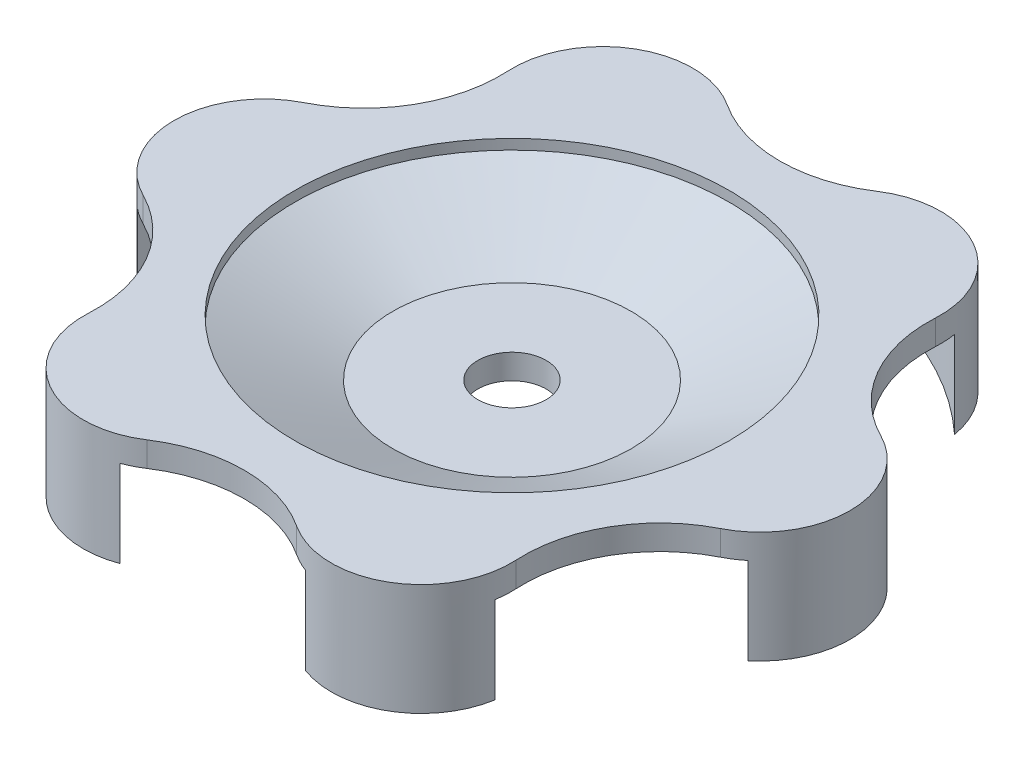
ISO-10303-21;
HEADER;
FILE_DESCRIPTION(('STEP AP214'),'2;1');
FILE_NAME('part.step','',(''),(''),'','','');
FILE_SCHEMA(('AUTOMOTIVE_DESIGN { 1 0 10303 214 1 1 1 1 }'));
ENDSEC;
DATA;
#1=APPLICATION_CONTEXT('core data for automotive mechanical design processes');
#2=APPLICATION_PROTOCOL_DEFINITION('international standard','automotive_design',2000,#1);
#3=PRODUCT_CONTEXT('',#1,'mechanical');
#4=PRODUCT('Part','Part','',(#3));
#5=PRODUCT_RELATED_PRODUCT_CATEGORY('part','',(#4));
#6=PRODUCT_DEFINITION_FORMATION('','',#4);
#7=PRODUCT_DEFINITION_CONTEXT('part definition',#1,'design');
#8=PRODUCT_DEFINITION('design','',#6,#7);
#9=PRODUCT_DEFINITION_SHAPE('','',#8);
#10=(LENGTH_UNIT() NAMED_UNIT(*) SI_UNIT(.MILLI.,.METRE.));
#11=(NAMED_UNIT(*) PLANE_ANGLE_UNIT() SI_UNIT($,.RADIAN.));
#12=(NAMED_UNIT(*) SI_UNIT($,.STERADIAN.) SOLID_ANGLE_UNIT());
#13=UNCERTAINTY_MEASURE_WITH_UNIT(LENGTH_MEASURE(1.E-05),#10,'distance_accuracy_value','');
#14=(GEOMETRIC_REPRESENTATION_CONTEXT(3) GLOBAL_UNCERTAINTY_ASSIGNED_CONTEXT((#13)) GLOBAL_UNIT_ASSIGNED_CONTEXT((#10,
#11,#12)) REPRESENTATION_CONTEXT('',''));
#15=CARTESIAN_POINT('',(0.,0.,0.));
#16=DIRECTION('',(0.,0.,1.));
#17=DIRECTION('',(1.,0.,0.));
#18=AXIS2_PLACEMENT_3D('',#15,#16,#17);
#19=CARTESIAN_POINT('',(0.,0.,0.));
#20=DIRECTION('',(0.,-1.,0.));
#21=DIRECTION('',(1.,0.,0.));
#22=AXIS2_PLACEMENT_3D('',#19,#20,#21);
#23=CYLINDRICAL_SURFACE('',#22,25.25);
#24=DIRECTION('',(0.,-1.,0.));
#25=VECTOR('',#24,1.);
#26=CARTESIAN_POINT('',(-17.1476738593355,5.5,18.5342866389259));
#27=LINE('',#26,#25);
#28=CARTESIAN_POINT('',(-17.1476738593355,6.99999999999987,18.5342866389259));
#29=VERTEX_POINT('',#28);
#30=CARTESIAN_POINT('',(-17.1476738593355,0.,18.5342866389259));
#31=VERTEX_POINT('',#30);
#32=EDGE_CURVE('E485',#29,#31,#27,.T.);
#33=ORIENTED_EDGE('',*,*,#32,.F.);
#34=CARTESIAN_POINT('',(0.,6.99999999999991,0.));
#35=DIRECTION('',(0.,-1.,0.));
#36=DIRECTION('',(1.,0.,0.));
#37=AXIS2_PLACEMENT_3D('',#34,#35,#36);
#38=CIRCLE('',#37,25.25);
#39=CARTESIAN_POINT('',(-7.47732614066478,6.9999999999999,24.1174644974577));
#40=VERTEX_POINT('',#39);
#41=EDGE_CURVE('E527',#40,#29,#38,.T.);
#42=ORIENTED_EDGE('',*,*,#41,.F.);
#43=DIRECTION('',(0.,-1.,0.));
#44=VECTOR('',#43,1.);
#45=CARTESIAN_POINT('',(-7.47732614066478,5.5,24.1174644974577));
#46=LINE('',#45,#44);
#47=CARTESIAN_POINT('',(-7.47732614066478,0.,24.1174644974577));
#48=VERTEX_POINT('',#47);
#49=EDGE_CURVE('E482',#48,#40,#46,.F.);
#50=ORIENTED_EDGE('',*,*,#49,.F.);
#51=CARTESIAN_POINT('',(0.,0.,0.));
#52=DIRECTION('',(0.,-1.,0.));
#53=DIRECTION('',(1.,0.,0.));
#54=AXIS2_PLACEMENT_3D('',#51,#52,#53);
#55=CIRCLE('',#54,25.25);
#56=EDGE_CURVE('E276',#48,#31,#55,.T.);
#57=ORIENTED_EDGE('',*,*,#56,.T.);
#58=EDGE_LOOP('',(#33,#42,#50,#57));
#59=FACE_BOUND('',#58,.T.);
#60=ADVANCED_FACE('F88',(#59),#23,.F.);
#61=DIRECTION('',(0.,-1.,0.));
#62=VECTOR('',#61,1.);
#63=CARTESIAN_POINT('',(7.4773261406646,5.5,24.1174644974578));
#64=LINE('',#63,#62);
#65=CARTESIAN_POINT('',(7.4773261406646,6.99999999999995,24.1174644974578));
#66=VERTEX_POINT('',#65);
#67=CARTESIAN_POINT('',(7.47732614066462,0.,24.1174644974578));
#68=VERTEX_POINT('',#67);
#69=EDGE_CURVE('E473',#66,#68,#64,.T.);
#70=ORIENTED_EDGE('',*,*,#69,.F.);
#71=CARTESIAN_POINT('',(17.1476738593353,6.99999999999998,18.5342866389259));
#72=VERTEX_POINT('',#71);
#73=EDGE_CURVE('E260',#72,#66,#38,.T.);
#74=ORIENTED_EDGE('',*,*,#73,.F.);
#75=DIRECTION('',(0.,-1.,0.));
#76=VECTOR('',#75,1.);
#77=CARTESIAN_POINT('',(17.1476738593353,5.5,18.5342866389259));
#78=LINE('',#77,#76);
#79=CARTESIAN_POINT('',(17.1476738593353,0.,18.534286638926));
#80=VERTEX_POINT('',#79);
#81=EDGE_CURVE('E469',#80,#72,#78,.F.);
#82=ORIENTED_EDGE('',*,*,#81,.F.);
#83=EDGE_CURVE('E282',#80,#68,#55,.T.);
#84=ORIENTED_EDGE('',*,*,#83,.T.);
#85=EDGE_LOOP('',(#70,#74,#82,#84));
#86=FACE_BOUND('',#85,.T.);
#87=ADVANCED_FACE('F572',(#86),#23,.F.);
#88=DIRECTION('',(0.,-1.,0.));
#89=VECTOR('',#88,1.);
#90=CARTESIAN_POINT('',(24.625,5.5,5.58317785853183));
#91=LINE('',#90,#89);
#92=CARTESIAN_POINT('',(24.625,7.00000000000001,5.58317785853185));
#93=VERTEX_POINT('',#92);
#94=CARTESIAN_POINT('',(24.625,0.,5.58317785853182));
#95=VERTEX_POINT('',#94);
#96=EDGE_CURVE('E458',#93,#95,#91,.T.);
#97=ORIENTED_EDGE('',*,*,#96,.F.);
#98=CARTESIAN_POINT('',(24.625,7.00000000000001,-5.58317785853171));
#99=VERTEX_POINT('',#98);
#100=EDGE_CURVE('E324',#99,#93,#38,.T.);
#101=ORIENTED_EDGE('',*,*,#100,.F.);
#102=DIRECTION('',(0.,-1.,0.));
#103=VECTOR('',#102,1.);
#104=CARTESIAN_POINT('',(24.625,5.5,-5.58317785853169));
#105=LINE('',#104,#103);
#106=CARTESIAN_POINT('',(24.6250000000001,0.,-5.58317785853168));
#107=VERTEX_POINT('',#106);
#108=EDGE_CURVE('E462',#107,#99,#105,.F.);
#109=ORIENTED_EDGE('',*,*,#108,.F.);
#110=EDGE_CURVE('E285',#107,#95,#55,.T.);
#111=ORIENTED_EDGE('',*,*,#110,.T.);
#112=EDGE_LOOP('',(#97,#101,#109,#111));
#113=FACE_BOUND('',#112,.T.);
#114=ADVANCED_FACE('F576',(#113),#23,.F.);
#115=DIRECTION('',(0.,-1.,0.));
#116=VECTOR('',#115,1.);
#117=CARTESIAN_POINT('',(17.1476738593356,5.5,-18.5342866389257));
#118=LINE('',#117,#116);
#119=CARTESIAN_POINT('',(17.1476738593356,6.99999999999998,-18.5342866389257));
#120=VERTEX_POINT('',#119);
#121=CARTESIAN_POINT('',(17.1476738593356,0.,-18.5342866389257));
#122=VERTEX_POINT('',#121);
#123=EDGE_CURVE('E445',#120,#122,#118,.T.);
#124=ORIENTED_EDGE('',*,*,#123,.F.);
#125=CARTESIAN_POINT('',(7.47732614066493,6.99999999999995,-24.1174644974577));
#126=VERTEX_POINT('',#125);
#127=EDGE_CURVE('E327',#126,#120,#38,.T.);
#128=ORIENTED_EDGE('',*,*,#127,.F.);
#129=DIRECTION('',(0.,-1.,0.));
#130=VECTOR('',#129,1.);
#131=CARTESIAN_POINT('',(7.47732614066493,5.5,-24.1174644974577));
#132=LINE('',#131,#130);
#133=CARTESIAN_POINT('',(7.47732614066493,0.,-24.1174644974577));
#134=VERTEX_POINT('',#133);
#135=EDGE_CURVE('E449',#134,#126,#132,.F.);
#136=ORIENTED_EDGE('',*,*,#135,.F.);
#137=EDGE_CURVE('E284',#134,#122,#55,.T.);
#138=ORIENTED_EDGE('',*,*,#137,.T.);
#139=EDGE_LOOP('',(#124,#128,#136,#138));
#140=FACE_BOUND('',#139,.T.);
#141=ADVANCED_FACE('F549',(#140),#23,.F.);
#142=DIRECTION('',(0.,-1.,0.));
#143=VECTOR('',#142,1.);
#144=CARTESIAN_POINT('',(-7.47732614066448,5.5,-24.1174644974578));
#145=LINE('',#144,#143);
#146=CARTESIAN_POINT('',(-7.47732614066448,6.9999999999999,-24.1174644974578));
#147=VERTEX_POINT('',#146);
#148=CARTESIAN_POINT('',(-7.47732614066446,0.,-24.1174644974578));
#149=VERTEX_POINT('',#148);
#150=EDGE_CURVE('E435',#147,#149,#145,.T.);
#151=ORIENTED_EDGE('',*,*,#150,.F.);
#152=CARTESIAN_POINT('',(-17.1476738593352,6.99999999999987,-18.5342866389261));
#153=VERTEX_POINT('',#152);
#154=EDGE_CURVE('E535',#153,#147,#38,.T.);
#155=ORIENTED_EDGE('',*,*,#154,.F.);
#156=DIRECTION('',(0.,-1.,0.));
#157=VECTOR('',#156,1.);
#158=CARTESIAN_POINT('',(-17.1476738593352,5.5,-18.5342866389261));
#159=LINE('',#158,#157);
#160=CARTESIAN_POINT('',(-17.1476738593352,0.,-18.5342866389261));
#161=VERTEX_POINT('',#160);
#162=EDGE_CURVE('E431',#161,#153,#159,.F.);
#163=ORIENTED_EDGE('',*,*,#162,.F.);
#164=EDGE_CURVE('E277',#161,#149,#55,.T.);
#165=ORIENTED_EDGE('',*,*,#164,.T.);
#166=EDGE_LOOP('',(#151,#155,#163,#165));
#167=FACE_BOUND('',#166,.T.);
#168=ADVANCED_FACE('F580',(#167),#23,.F.);
#169=CARTESIAN_POINT('',(27.25,7.00000000000002,0.));
#170=DIRECTION('',(0.,-1.,0.));
#171=DIRECTION('',(1.,0.,0.));
#172=AXIS2_PLACEMENT_3D('',#169,#170,#171);
#173=PLANE('',#172);
#174=CARTESIAN_POINT('',(0.,6.99999999999993,0.));
#175=DIRECTION('',(0.,-1.,0.));
#176=DIRECTION('',(1.,0.,0.));
#177=AXIS2_PLACEMENT_3D('',#174,#175,#176);
#178=CIRCLE('',#177,19.5);
#179=CARTESIAN_POINT('',(19.5,7.,0.));
#180=VERTEX_POINT('',#179);
#181=EDGE_CURVE('E320',#180,#180,#178,.T.);
#182=ORIENTED_EDGE('',*,*,#181,.F.);
#183=EDGE_LOOP('',(#182));
#184=FACE_BOUND('',#183,.T.);
#185=CARTESIAN_POINT('',(-10.0000000000001,6.99999999999989,17.3205080756887));
#186=DIRECTION('',(0.,-1.,0.));
#187=DIRECTION('',(1.,0.,0.));
#188=AXIS2_PLACEMENT_3D('',#185,#186,#187);
#189=CIRCLE('',#188,7.25000000000001);
#190=CARTESIAN_POINT('',(-6.02739726027408,6.99999999999996,23.385236220653));
#191=VERTEX_POINT('',#190);
#192=EDGE_CURVE('E479',#40,#191,#189,.F.);
#193=ORIENTED_EDGE('',*,*,#192,.F.);
#194=ORIENTED_EDGE('',*,*,#41,.T.);
#195=CARTESIAN_POINT('',(-17.2385100104486,6.99999999999991,16.9124972564244));
#196=VERTEX_POINT('',#195);
#197=EDGE_CURVE('E112',#196,#29,#189,.F.);
#198=ORIENTED_EDGE('',*,*,#197,.F.);
#199=CARTESIAN_POINT('',(-28.2210769228533,6.99999999999983,16.2934463582302));
#200=DIRECTION('',(0.,-1.,0.));
#201=DIRECTION('',(1.,0.,0.));
#202=AXIS2_PLACEMENT_3D('',#199,#200,#201);
#203=CIRCLE('',#202,11.);
#204=CARTESIAN_POINT('',(-23.2659072707225,6.99999999999988,6.47273896422836));
#205=VERTEX_POINT('',#204);
#206=EDGE_CURVE('E290',#196,#205,#203,.F.);
#207=ORIENTED_EDGE('',*,*,#206,.T.);
#208=CARTESIAN_POINT('',(-20.,6.99999999999985,-1.39659253553725E-13));
#209=DIRECTION('',(0.,-1.,0.));
#210=DIRECTION('',(1.,0.,0.));
#211=AXIS2_PLACEMENT_3D('',#208,#209,#210);
#212=CIRCLE('',#211,7.25000000000001);
#213=CARTESIAN_POINT('',(-24.6250000000001,6.99999999999984,5.58317785853161));
#214=VERTEX_POINT('',#213);
#215=EDGE_CURVE('E419',#214,#205,#212,.F.);
#216=ORIENTED_EDGE('',*,*,#215,.F.);
#217=CARTESIAN_POINT('',(-24.625,6.99999999999984,-5.58317785853195));
#218=VERTEX_POINT('',#217);
#219=EDGE_CURVE('E531',#214,#218,#38,.T.);
#220=ORIENTED_EDGE('',*,*,#219,.T.);
#221=CARTESIAN_POINT('',(-23.2659072707224,6.99999999999988,-6.47273896422873));
#222=VERTEX_POINT('',#221);
#223=EDGE_CURVE('E267',#222,#218,#212,.F.);
#224=ORIENTED_EDGE('',*,*,#223,.F.);
#225=CARTESIAN_POINT('',(-28.221076922853,6.99999999999983,-16.2934463582307));
#226=DIRECTION('',(0.,-1.,0.));
#227=DIRECTION('',(1.,0.,0.));
#228=AXIS2_PLACEMENT_3D('',#225,#226,#227);
#229=CIRCLE('',#228,11.);
#230=CARTESIAN_POINT('',(-17.2385100104484,6.99999999999986,-16.9124972564247));
#231=VERTEX_POINT('',#230);
#232=EDGE_CURVE('E488',#222,#231,#229,.F.);
#233=ORIENTED_EDGE('',*,*,#232,.T.);
#234=CARTESIAN_POINT('',(-9.99999999999984,6.99999999999989,-17.3205080756889));
#235=DIRECTION('',(0.,-1.,0.));
#236=DIRECTION('',(1.,0.,0.));
#237=AXIS2_PLACEMENT_3D('',#234,#235,#236);
#238=CIRCLE('',#237,7.25000000000001);
#239=EDGE_CURVE('E428',#153,#231,#238,.F.);
#240=ORIENTED_EDGE('',*,*,#239,.F.);
#241=ORIENTED_EDGE('',*,*,#154,.T.);
#242=CARTESIAN_POINT('',(-6.02739726027371,6.99999999999991,-23.3852362206531));
#243=VERTEX_POINT('',#242);
#244=EDGE_CURVE('E432',#243,#147,#238,.F.);
#245=ORIENTED_EDGE('',*,*,#244,.F.);
#246=CARTESIAN_POINT('',(3.92047505570758E-13,6.99999999999992,-32.5868927164608));
#247=DIRECTION('',(0.,-1.,0.));
#248=DIRECTION('',(1.,0.,0.));
#249=AXIS2_PLACEMENT_3D('',#246,#247,#248);
#250=CIRCLE('',#249,11.);
#251=CARTESIAN_POINT('',(6.02739726027424,6.99999999999996,-23.385236220653));
#252=VERTEX_POINT('',#251);
#253=EDGE_CURVE('E492',#243,#252,#250,.F.);
#254=ORIENTED_EDGE('',*,*,#253,.T.);
#255=CARTESIAN_POINT('',(10.0000000000002,6.99999999999996,-17.3205080756887));
#256=DIRECTION('',(0.,-1.,0.));
#257=DIRECTION('',(1.,0.,0.));
#258=AXIS2_PLACEMENT_3D('',#255,#256,#257);
#259=CIRCLE('',#258,7.25000000000003);
#260=EDGE_CURVE('E446',#126,#252,#259,.F.);
#261=ORIENTED_EDGE('',*,*,#260,.F.);
#262=ORIENTED_EDGE('',*,*,#127,.T.);
#263=CARTESIAN_POINT('',(17.2385100104488,6.99999999999998,-16.9124972564243));
#264=VERTEX_POINT('',#263);
#265=EDGE_CURVE('E442',#264,#120,#259,.F.);
#266=ORIENTED_EDGE('',*,*,#265,.F.);
#267=CARTESIAN_POINT('',(28.2210769228534,7.00000000000002,-16.29344635823));
#268=DIRECTION('',(0.,-1.,0.));
#269=DIRECTION('',(1.,0.,0.));
#270=AXIS2_PLACEMENT_3D('',#267,#268,#269);
#271=CIRCLE('',#270,10.9999999999999);
#272=CARTESIAN_POINT('',(23.2659072707226,7.00000000000006,-6.47273896422836));
#273=VERTEX_POINT('',#272);
#274=EDGE_CURVE('E496',#264,#273,#271,.F.);
#275=ORIENTED_EDGE('',*,*,#274,.T.);
#276=CARTESIAN_POINT('',(20.,6.99999999999999,0.));
#277=DIRECTION('',(0.,-1.,0.));
#278=DIRECTION('',(1.,0.,0.));
#279=AXIS2_PLACEMENT_3D('',#276,#277,#278);
#280=CIRCLE('',#279,7.24999999999996);
#281=EDGE_CURVE('E459',#99,#273,#280,.F.);
#282=ORIENTED_EDGE('',*,*,#281,.F.);
#283=ORIENTED_EDGE('',*,*,#100,.T.);
#284=CARTESIAN_POINT('',(23.2659072707225,7.00000000000002,6.47273896422858));
#285=VERTEX_POINT('',#284);
#286=EDGE_CURVE('E455',#285,#93,#280,.F.);
#287=ORIENTED_EDGE('',*,*,#286,.F.);
#288=CARTESIAN_POINT('',(28.2210769228531,7.00000000000002,16.2934463582305));
#289=DIRECTION('',(0.,-1.,0.));
#290=DIRECTION('',(1.,0.,0.));
#291=AXIS2_PLACEMENT_3D('',#288,#289,#290);
#292=CIRCLE('',#291,11.);
#293=CARTESIAN_POINT('',(17.2385100104485,7.00000000000006,16.9124972564245));
#294=VERTEX_POINT('',#293);
#295=EDGE_CURVE('E500',#285,#294,#292,.F.);
#296=ORIENTED_EDGE('',*,*,#295,.T.);
#297=CARTESIAN_POINT('',(9.99999999999996,6.99999999999996,17.3205080756888));
#298=DIRECTION('',(0.,-1.,0.));
#299=DIRECTION('',(1.,0.,0.));
#300=AXIS2_PLACEMENT_3D('',#297,#298,#299);
#301=CIRCLE('',#300,7.25000000000002);
#302=EDGE_CURVE('E379',#72,#294,#301,.F.);
#303=ORIENTED_EDGE('',*,*,#302,.F.);
#304=ORIENTED_EDGE('',*,*,#73,.T.);
#305=CARTESIAN_POINT('',(6.02739726027388,6.99999999999998,23.385236220653));
#306=VERTEX_POINT('',#305);
#307=EDGE_CURVE('E470',#306,#66,#301,.F.);
#308=ORIENTED_EDGE('',*,*,#307,.F.);
#309=CARTESIAN_POINT('',(-1.66533453693773E-13,6.99999999999992,32.5868927164608));
#310=DIRECTION('',(0.,-1.,0.));
#311=DIRECTION('',(1.,0.,0.));
#312=AXIS2_PLACEMENT_3D('',#309,#310,#311);
#313=CIRCLE('',#312,11.);
#314=EDGE_CURVE('E502',#306,#191,#313,.F.);
#315=ORIENTED_EDGE('',*,*,#314,.T.);
#316=EDGE_LOOP('',(#193,#194,#198,#207,#216,#220,#224,#233,#240,#241,#245,#254,#261,#262,#266,
#275,#282,#283,#287,#296,#303,#304,#308,#315));
#317=FACE_BOUND('',#316,.T.);
#318=ADVANCED_FACE('F511',(#184,#317),#173,.T.);
#319=CARTESIAN_POINT('',(27.25,9.00000000000002,0.));
#320=DIRECTION('',(0.,-1.,0.));
#321=DIRECTION('',(1.,0.,0.));
#322=AXIS2_PLACEMENT_3D('',#319,#320,#321);
#323=PLANE('',#322);
#324=CARTESIAN_POINT('',(-1.66533453693773E-13,8.99999999999992,32.5868927164608));
#325=DIRECTION('',(0.,-1.,0.));
#326=DIRECTION('',(1.,0.,0.));
#327=AXIS2_PLACEMENT_3D('',#324,#325,#326);
#328=CIRCLE('',#327,11.);
#329=CARTESIAN_POINT('',(6.02739726027388,8.99999999999998,23.385236220653));
#330=VERTEX_POINT('',#329);
#331=CARTESIAN_POINT('',(-6.02739726027408,8.99999999999996,23.385236220653));
#332=VERTEX_POINT('',#331);
#333=EDGE_CURVE('E13',#330,#332,#328,.F.);
#334=ORIENTED_EDGE('',*,*,#333,.F.);
#335=CARTESIAN_POINT('',(9.99999999999996,8.99999999999996,17.3205080756888));
#336=DIRECTION('',(0.,-1.,0.));
#337=DIRECTION('',(1.,0.,0.));
#338=AXIS2_PLACEMENT_3D('',#335,#336,#337);
#339=CIRCLE('',#338,7.25000000000002);
#340=CARTESIAN_POINT('',(17.2385100104485,9.00000000000006,16.9124972564245));
#341=VERTEX_POINT('',#340);
#342=EDGE_CURVE('E376',#330,#341,#339,.F.);
#343=ORIENTED_EDGE('',*,*,#342,.T.);
#344=CARTESIAN_POINT('',(28.2210769228531,9.00000000000002,16.2934463582305));
#345=DIRECTION('',(0.,-1.,0.));
#346=DIRECTION('',(1.,0.,0.));
#347=AXIS2_PLACEMENT_3D('',#344,#345,#346);
#348=CIRCLE('',#347,11.);
#349=CARTESIAN_POINT('',(23.2659072707225,9.00000000000002,6.47273896422858));
#350=VERTEX_POINT('',#349);
#351=EDGE_CURVE('E97',#350,#341,#348,.F.);
#352=ORIENTED_EDGE('',*,*,#351,.F.);
#353=CARTESIAN_POINT('',(20.,8.99999999999999,0.));
#354=DIRECTION('',(0.,-1.,0.));
#355=DIRECTION('',(1.,0.,0.));
#356=AXIS2_PLACEMENT_3D('',#353,#354,#355);
#357=CIRCLE('',#356,7.24999999999996);
#358=CARTESIAN_POINT('',(23.2659072707226,9.00000000000006,-6.47273896422836));
#359=VERTEX_POINT('',#358);
#360=EDGE_CURVE('E452',#350,#359,#357,.F.);
#361=ORIENTED_EDGE('',*,*,#360,.T.);
#362=CARTESIAN_POINT('',(28.2210769228534,9.00000000000002,-16.29344635823));
#363=DIRECTION('',(0.,-1.,0.));
#364=DIRECTION('',(1.,0.,0.));
#365=AXIS2_PLACEMENT_3D('',#362,#363,#364);
#366=CIRCLE('',#365,10.9999999999999);
#367=CARTESIAN_POINT('',(17.2385100104488,8.99999999999998,-16.9124972564243));
#368=VERTEX_POINT('',#367);
#369=EDGE_CURVE('E358',#368,#359,#366,.F.);
#370=ORIENTED_EDGE('',*,*,#369,.F.);
#371=CARTESIAN_POINT('',(10.0000000000002,8.99999999999996,-17.3205080756887));
#372=DIRECTION('',(0.,-1.,0.));
#373=DIRECTION('',(1.,0.,0.));
#374=AXIS2_PLACEMENT_3D('',#371,#372,#373);
#375=CIRCLE('',#374,7.25000000000003);
#376=CARTESIAN_POINT('',(6.02739726027424,8.99999999999996,-23.385236220653));
#377=VERTEX_POINT('',#376);
#378=EDGE_CURVE('E438',#368,#377,#375,.F.);
#379=ORIENTED_EDGE('',*,*,#378,.T.);
#380=CARTESIAN_POINT('',(3.92047505570758E-13,8.99999999999992,-32.5868927164608));
#381=DIRECTION('',(0.,-1.,0.));
#382=DIRECTION('',(1.,0.,0.));
#383=AXIS2_PLACEMENT_3D('',#380,#381,#382);
#384=CIRCLE('',#383,11.);
#385=CARTESIAN_POINT('',(-6.02739726027371,8.99999999999991,-23.3852362206531));
#386=VERTEX_POINT('',#385);
#387=EDGE_CURVE('E355',#386,#377,#384,.F.);
#388=ORIENTED_EDGE('',*,*,#387,.F.);
#389=CARTESIAN_POINT('',(-9.99999999999984,8.99999999999989,-17.3205080756889));
#390=DIRECTION('',(0.,-1.,0.));
#391=DIRECTION('',(1.,0.,0.));
#392=AXIS2_PLACEMENT_3D('',#389,#390,#391);
#393=CIRCLE('',#392,7.25000000000001);
#394=CARTESIAN_POINT('',(-17.2385100104484,8.99999999999986,-16.9124972564247));
#395=VERTEX_POINT('',#394);
#396=EDGE_CURVE('E272',#386,#395,#393,.F.);
#397=ORIENTED_EDGE('',*,*,#396,.T.);
#398=CARTESIAN_POINT('',(-28.221076922853,8.99999999999983,-16.2934463582307));
#399=DIRECTION('',(0.,-1.,0.));
#400=DIRECTION('',(1.,0.,0.));
#401=AXIS2_PLACEMENT_3D('',#398,#399,#400);
#402=CIRCLE('',#401,11.);
#403=CARTESIAN_POINT('',(-23.2659072707224,8.99999999999988,-6.47273896422873));
#404=VERTEX_POINT('',#403);
#405=EDGE_CURVE('E348',#404,#395,#402,.F.);
#406=ORIENTED_EDGE('',*,*,#405,.F.);
#407=CARTESIAN_POINT('',(-20.,8.99999999999986,-1.39659253553725E-13));
#408=DIRECTION('',(0.,-1.,0.));
#409=DIRECTION('',(1.,0.,0.));
#410=AXIS2_PLACEMENT_3D('',#407,#408,#409);
#411=CIRCLE('',#410,7.25000000000001);
#412=CARTESIAN_POINT('',(-23.2659072707225,8.99999999999985,6.47273896422836));
#413=VERTEX_POINT('',#412);
#414=EDGE_CURVE('E104',#404,#413,#411,.F.);
#415=ORIENTED_EDGE('',*,*,#414,.T.);
#416=CARTESIAN_POINT('',(-28.2210769228533,8.99999999999983,16.2934463582302));
#417=DIRECTION('',(0.,-1.,0.));
#418=DIRECTION('',(1.,0.,0.));
#419=AXIS2_PLACEMENT_3D('',#416,#417,#418);
#420=CIRCLE('',#419,11.);
#421=CARTESIAN_POINT('',(-17.2385100104486,8.99999999999991,16.9124972564244));
#422=VERTEX_POINT('',#421);
#423=EDGE_CURVE('E351',#422,#413,#420,.F.);
#424=ORIENTED_EDGE('',*,*,#423,.F.);
#425=CARTESIAN_POINT('',(-10.0000000000001,8.99999999999989,17.3205080756887));
#426=DIRECTION('',(0.,-1.,0.));
#427=DIRECTION('',(1.,0.,0.));
#428=AXIS2_PLACEMENT_3D('',#425,#426,#427);
#429=CIRCLE('',#428,7.25000000000001);
#430=EDGE_CURVE('E476',#422,#332,#429,.F.);
#431=ORIENTED_EDGE('',*,*,#430,.T.);
#432=EDGE_LOOP('',(#334,#343,#352,#361,#370,#379,#388,#397,#406,#415,#424,#431));
#433=FACE_BOUND('',#432,.T.);
#434=CARTESIAN_POINT('',(0.,8.99999999999994,0.));
#435=DIRECTION('',(0.,-1.,0.));
#436=DIRECTION('',(1.,0.,0.));
#437=AXIS2_PLACEMENT_3D('',#434,#435,#436);
#438=CIRCLE('',#437,17.5);
#439=CARTESIAN_POINT('',(17.5,9.,0.));
#440=VERTEX_POINT('',#439);
#441=EDGE_CURVE('E292',#440,#440,#438,.T.);
#442=ORIENTED_EDGE('',*,*,#441,.T.);
#443=EDGE_LOOP('',(#442));
#444=FACE_BOUND('',#443,.T.);
#445=ADVANCED_FACE('F594',(#433,#444),#323,.F.);
#446=CARTESIAN_POINT('',(27.25,0.,0.));
#447=DIRECTION('',(0.,1.,0.));
#448=DIRECTION('',(-1.,0.,0.));
#449=AXIS2_PLACEMENT_3D('',#446,#447,#448);
#450=PLANE('',#449);
#451=ORIENTED_EDGE('',*,*,#56,.F.);
#452=CARTESIAN_POINT('',(-10.0000000000001,-1.28369537222284E-13,17.3205080756887));
#453=DIRECTION('',(0.,1.,0.));
#454=DIRECTION('',(-1.,0.,0.));
#455=AXIS2_PLACEMENT_3D('',#452,#453,#454);
#456=CIRCLE('',#455,7.25000000000001);
#457=EDGE_CURVE('E344',#48,#31,#456,.F.);
#458=ORIENTED_EDGE('',*,*,#457,.T.);
#459=EDGE_LOOP('',(#451,#458));
#460=FACE_BOUND('',#459,.T.);
#461=ADVANCED_FACE('F568',(#460),#450,.F.);
#462=ORIENTED_EDGE('',*,*,#83,.F.);
#463=CARTESIAN_POINT('',(9.99999999999996,0.,17.3205080756888));
#464=DIRECTION('',(0.,1.,0.));
#465=DIRECTION('',(-1.,0.,0.));
#466=AXIS2_PLACEMENT_3D('',#463,#464,#465);
#467=CIRCLE('',#466,7.25000000000002);
#468=EDGE_CURVE('E340',#80,#68,#467,.F.);
#469=ORIENTED_EDGE('',*,*,#468,.T.);
#470=EDGE_LOOP('',(#462,#469));
#471=FACE_BOUND('',#470,.T.);
#472=ADVANCED_FACE('F566',(#471),#450,.F.);
#473=ORIENTED_EDGE('',*,*,#110,.F.);
#474=CARTESIAN_POINT('',(20.,0.,0.));
#475=DIRECTION('',(0.,1.,0.));
#476=DIRECTION('',(-1.,0.,0.));
#477=AXIS2_PLACEMENT_3D('',#474,#475,#476);
#478=CIRCLE('',#477,7.24999999999996);
#479=EDGE_CURVE('E336',#107,#95,#478,.F.);
#480=ORIENTED_EDGE('',*,*,#479,.T.);
#481=EDGE_LOOP('',(#473,#480));
#482=FACE_BOUND('',#481,.T.);
#483=ADVANCED_FACE('F559',(#482),#450,.F.);
#484=ORIENTED_EDGE('',*,*,#137,.F.);
#485=CARTESIAN_POINT('',(10.0000000000002,0.,-17.3205080756887));
#486=DIRECTION('',(0.,1.,0.));
#487=DIRECTION('',(-1.,0.,0.));
#488=AXIS2_PLACEMENT_3D('',#485,#486,#487);
#489=CIRCLE('',#488,7.25000000000003);
#490=EDGE_CURVE('E332',#134,#122,#489,.F.);
#491=ORIENTED_EDGE('',*,*,#490,.T.);
#492=EDGE_LOOP('',(#484,#491));
#493=FACE_BOUND('',#492,.T.);
#494=ADVANCED_FACE('F555',(#493),#450,.F.);
#495=ORIENTED_EDGE('',*,*,#164,.F.);
#496=CARTESIAN_POINT('',(-9.99999999999984,-1.28369537222284E-13,-17.3205080756889));
#497=DIRECTION('',(0.,1.,0.));
#498=DIRECTION('',(-1.,0.,0.));
#499=AXIS2_PLACEMENT_3D('',#496,#497,#498);
#500=CIRCLE('',#499,7.25000000000001);
#501=EDGE_CURVE('E259',#161,#149,#500,.F.);
#502=ORIENTED_EDGE('',*,*,#501,.T.);
#503=EDGE_LOOP('',(#495,#502));
#504=FACE_BOUND('',#503,.T.);
#505=ADVANCED_FACE('F558',(#504),#450,.F.);
#506=CARTESIAN_POINT('',(-20.,-1.61329283265843E-13,-1.39659253553725E-13));
#507=DIRECTION('',(0.,1.,0.));
#508=DIRECTION('',(-1.,0.,0.));
#509=AXIS2_PLACEMENT_3D('',#506,#507,#508);
#510=CIRCLE('',#509,7.25000000000001);
#511=CARTESIAN_POINT('',(-24.6250000000001,0.,5.58317785853164));
#512=VERTEX_POINT('',#511);
#513=CARTESIAN_POINT('',(-24.625,0.,-5.58317785853198));
#514=VERTEX_POINT('',#513);
#515=EDGE_CURVE('E251',#512,#514,#510,.F.);
#516=ORIENTED_EDGE('',*,*,#515,.T.);
#517=EDGE_CURVE('E255',#512,#514,#55,.T.);
#518=ORIENTED_EDGE('',*,*,#517,.F.);
#519=EDGE_LOOP('',(#516,#518));
#520=FACE_BOUND('',#519,.T.);
#521=ADVANCED_FACE('F253',(#520),#450,.F.);
#522=DIRECTION('',(0.,-1.,0.));
#523=VECTOR('',#522,1.);
#524=CARTESIAN_POINT('',(-24.625,5.5,-5.58317785853196));
#525=LINE('',#524,#523);
#526=EDGE_CURVE('E263',#218,#514,#525,.T.);
#527=ORIENTED_EDGE('',*,*,#526,.F.);
#528=ORIENTED_EDGE('',*,*,#219,.F.);
#529=DIRECTION('',(0.,-1.,0.));
#530=VECTOR('',#529,1.);
#531=CARTESIAN_POINT('',(-24.6250000000001,5.5,5.58317785853161));
#532=LINE('',#531,#530);
#533=EDGE_CURVE('E274',#512,#214,#532,.F.);
#534=ORIENTED_EDGE('',*,*,#533,.F.);
#535=ORIENTED_EDGE('',*,*,#517,.T.);
#536=EDGE_LOOP('',(#527,#528,#534,#535));
#537=FACE_BOUND('',#536,.T.);
#538=ADVANCED_FACE('F90',(#537),#23,.F.);
#539=CARTESIAN_POINT('',(0.,0.,0.));
#540=DIRECTION('',(0.,-1.,0.));
#541=DIRECTION('',(1.,0.,0.));
#542=AXIS2_PLACEMENT_3D('',#539,#540,#541);
#543=CYLINDRICAL_SURFACE('',#542,19.5);
#544=ORIENTED_EDGE('',*,*,#181,.T.);
#545=EDGE_LOOP('',(#544));
#546=FACE_BOUND('',#545,.T.);
#547=CARTESIAN_POINT('',(0.,6.90585947838493,0.));
#548=DIRECTION('',(0.,-1.,0.));
#549=DIRECTION('',(1.,0.,0.));
#550=AXIS2_PLACEMENT_3D('',#547,#548,#549);
#551=CIRCLE('',#550,19.5);
#552=CARTESIAN_POINT('',(19.5,6.905859478385,0.));
#553=VERTEX_POINT('',#552);
#554=EDGE_CURVE('E316',#553,#553,#551,.T.);
#555=ORIENTED_EDGE('',*,*,#554,.F.);
#556=EDGE_LOOP('',(#555));
#557=FACE_BOUND('',#556,.T.);
#558=ADVANCED_FACE('F579',(#546,#557),#543,.T.);
#559=CARTESIAN_POINT('',(0.,2.49999999999996,0.));
#560=DIRECTION('',(0.,1.,0.));
#561=DIRECTION('',(-1.,0.,0.));
#562=AXIS2_PLACEMENT_3D('',#559,#560,#561);
#563=CONICAL_SURFACE('',#562,10.0516038578106,1.13446401379632);
#564=ORIENTED_EDGE('',*,*,#554,.T.);
#565=EDGE_LOOP('',(#564));
#566=FACE_BOUND('',#565,.T.);
#567=CARTESIAN_POINT('',(0.,2.49999999999996,0.));
#568=DIRECTION('',(0.,-1.,0.));
#569=DIRECTION('',(1.,0.,0.));
#570=AXIS2_PLACEMENT_3D('',#567,#568,#569);
#571=CIRCLE('',#570,10.0516038578106);
#572=CARTESIAN_POINT('',(10.0516038578106,2.49999999999999,0.));
#573=VERTEX_POINT('',#572);
#574=EDGE_CURVE('E312',#573,#573,#571,.T.);
#575=ORIENTED_EDGE('',*,*,#574,.F.);
#576=EDGE_LOOP('',(#575));
#577=FACE_BOUND('',#576,.T.);
#578=ADVANCED_FACE('F585',(#566,#577),#563,.T.);
#579=CARTESIAN_POINT('',(2.75,2.49999999999998,0.));
#580=DIRECTION('',(0.,-1.,0.));
#581=DIRECTION('',(1.,0.,0.));
#582=AXIS2_PLACEMENT_3D('',#579,#580,#581);
#583=PLANE('',#582);
#584=ORIENTED_EDGE('',*,*,#574,.T.);
#585=EDGE_LOOP('',(#584));
#586=FACE_BOUND('',#585,.T.);
#587=CARTESIAN_POINT('',(0.,2.49999999999999,0.));
#588=DIRECTION('',(0.,-1.,0.));
#589=DIRECTION('',(1.,0.,0.));
#590=AXIS2_PLACEMENT_3D('',#587,#588,#589);
#591=CIRCLE('',#590,2.75000000000001);
#592=CARTESIAN_POINT('',(2.75,2.5,0.));
#593=VERTEX_POINT('',#592);
#594=EDGE_CURVE('E308',#593,#593,#591,.T.);
#595=ORIENTED_EDGE('',*,*,#594,.F.);
#596=EDGE_LOOP('',(#595));
#597=FACE_BOUND('',#596,.T.);
#598=ADVANCED_FACE('F667',(#586,#597),#583,.T.);
#599=CARTESIAN_POINT('',(0.,0.,0.));
#600=DIRECTION('',(0.,-1.,0.));
#601=DIRECTION('',(1.,0.,0.));
#602=AXIS2_PLACEMENT_3D('',#599,#600,#601);
#603=CYLINDRICAL_SURFACE('',#602,2.75000000000001);
#604=CARTESIAN_POINT('',(0.,4.49999999999999,0.));
#605=DIRECTION('',(0.,-1.,0.));
#606=DIRECTION('',(1.,0.,0.));
#607=AXIS2_PLACEMENT_3D('',#604,#605,#606);
#608=CIRCLE('',#607,2.75000000000002);
#609=CARTESIAN_POINT('',(2.75,4.5,0.));
#610=VERTEX_POINT('',#609);
#611=EDGE_CURVE('E304',#610,#610,#608,.T.);
#612=ORIENTED_EDGE('',*,*,#611,.F.);
#613=EDGE_LOOP('',(#612));
#614=FACE_BOUND('',#613,.T.);
#615=ORIENTED_EDGE('',*,*,#594,.T.);
#616=EDGE_LOOP('',(#615));
#617=FACE_BOUND('',#616,.T.);
#618=ADVANCED_FACE('F663',(#614,#617),#603,.F.);
#619=CARTESIAN_POINT('',(2.75,4.49999999999998,0.));
#620=DIRECTION('',(0.,-1.,0.));
#621=DIRECTION('',(1.,0.,0.));
#622=AXIS2_PLACEMENT_3D('',#619,#620,#621);
#623=PLANE('',#622);
#624=CARTESIAN_POINT('',(0.,4.49999999999996,0.));
#625=DIRECTION('',(0.,-1.,0.));
#626=DIRECTION('',(1.,0.,0.));
#627=AXIS2_PLACEMENT_3D('',#624,#625,#626);
#628=CIRCLE('',#627,9.60821453252471);
#629=CARTESIAN_POINT('',(9.6082145325247,4.5,0.));
#630=VERTEX_POINT('',#629);
#631=EDGE_CURVE('E300',#630,#630,#628,.T.);
#632=ORIENTED_EDGE('',*,*,#631,.F.);
#633=EDGE_LOOP('',(#632));
#634=FACE_BOUND('',#633,.T.);
#635=ORIENTED_EDGE('',*,*,#611,.T.);
#636=EDGE_LOOP('',(#635));
#637=FACE_BOUND('',#636,.T.);
#638=ADVANCED_FACE('F655',(#634,#637),#623,.F.);
#639=CARTESIAN_POINT('',(0.,4.49999999999996,0.));
#640=DIRECTION('',(0.,1.,0.));
#641=DIRECTION('',(-1.,0.,0.));
#642=AXIS2_PLACEMENT_3D('',#639,#640,#641);
#643=CONICAL_SURFACE('',#642,9.60821453252471,1.13446401379632);
#644=CARTESIAN_POINT('',(0.,8.17999999999993,0.));
#645=DIRECTION('',(0.,-1.,0.));
#646=DIRECTION('',(1.,0.,0.));
#647=AXIS2_PLACEMENT_3D('',#644,#645,#646);
#648=CIRCLE('',#647,17.5);
#649=CARTESIAN_POINT('',(17.5,8.17999999999999,0.));
#650=VERTEX_POINT('',#649);
#651=EDGE_CURVE('E296',#650,#650,#648,.T.);
#652=ORIENTED_EDGE('',*,*,#651,.F.);
#653=EDGE_LOOP('',(#652));
#654=FACE_BOUND('',#653,.T.);
#655=ORIENTED_EDGE('',*,*,#631,.T.);
#656=EDGE_LOOP('',(#655));
#657=FACE_BOUND('',#656,.T.);
#658=ADVANCED_FACE('F649',(#654,#657),#643,.F.);
#659=CARTESIAN_POINT('',(0.,0.,0.));
#660=DIRECTION('',(0.,-1.,0.));
#661=DIRECTION('',(1.,0.,0.));
#662=AXIS2_PLACEMENT_3D('',#659,#660,#661);
#663=CYLINDRICAL_SURFACE('',#662,17.5);
#664=ORIENTED_EDGE('',*,*,#441,.F.);
#665=EDGE_LOOP('',(#664));
#666=FACE_BOUND('',#665,.T.);
#667=ORIENTED_EDGE('',*,*,#651,.T.);
#668=EDGE_LOOP('',(#667));
#669=FACE_BOUND('',#668,.T.);
#670=ADVANCED_FACE('F643',(#666,#669),#663,.F.);
#671=CARTESIAN_POINT('',(-28.2210769228533,11.,16.2934463582302));
#672=DIRECTION('',(0.,-1.,0.));
#673=DIRECTION('',(0.,0.,-1.));
#674=AXIS2_PLACEMENT_3D('',#671,#672,#673);
#675=CYLINDRICAL_SURFACE('',#674,11.);
#676=DIRECTION('',(0.,-1.,0.));
#677=VECTOR('',#676,1.);
#678=CARTESIAN_POINT('',(-17.2385100104486,11.,16.9124972564244));
#679=LINE('',#678,#677);
#680=EDGE_CURVE('E420',#422,#196,#679,.T.);
#681=ORIENTED_EDGE('',*,*,#680,.F.);
#682=ORIENTED_EDGE('',*,*,#423,.T.);
#683=DIRECTION('',(0.,-1.,0.));
#684=VECTOR('',#683,1.);
#685=CARTESIAN_POINT('',(-23.2659072707225,11.,6.47273896422836));
#686=LINE('',#685,#684);
#687=EDGE_CURVE('E413',#413,#205,#686,.T.);
#688=ORIENTED_EDGE('',*,*,#687,.T.);
#689=ORIENTED_EDGE('',*,*,#206,.F.);
#690=EDGE_LOOP('',(#681,#682,#688,#689));
#691=FACE_BOUND('',#690,.T.);
#692=ADVANCED_FACE('F515',(#691),#675,.F.);
#693=CARTESIAN_POINT('',(-1.66533453693773E-13,11.,32.5868927164608));
#694=DIRECTION('',(0.,-1.,0.));
#695=DIRECTION('',(0.,0.,-1.));
#696=AXIS2_PLACEMENT_3D('',#693,#694,#695);
#697=CYLINDRICAL_SURFACE('',#696,11.);
#698=DIRECTION('',(0.,-1.,0.));
#699=VECTOR('',#698,1.);
#700=CARTESIAN_POINT('',(6.02739726027388,11.,23.385236220653));
#701=LINE('',#700,#699);
#702=EDGE_CURVE('E381',#330,#306,#701,.T.);
#703=ORIENTED_EDGE('',*,*,#702,.F.);
#704=ORIENTED_EDGE('',*,*,#333,.T.);
#705=DIRECTION('',(0.,-1.,0.));
#706=VECTOR('',#705,1.);
#707=CARTESIAN_POINT('',(-6.02739726027408,11.,23.385236220653));
#708=LINE('',#707,#706);
#709=EDGE_CURVE('E385',#332,#191,#708,.T.);
#710=ORIENTED_EDGE('',*,*,#709,.T.);
#711=ORIENTED_EDGE('',*,*,#314,.F.);
#712=EDGE_LOOP('',(#703,#704,#710,#711));
#713=FACE_BOUND('',#712,.T.);
#714=ADVANCED_FACE('F523',(#713),#697,.F.);
#715=CARTESIAN_POINT('',(28.2210769228531,11.,16.2934463582305));
#716=DIRECTION('',(0.,-1.,0.));
#717=DIRECTION('',(0.,0.,-1.));
#718=AXIS2_PLACEMENT_3D('',#715,#716,#717);
#719=CYLINDRICAL_SURFACE('',#718,11.);
#720=DIRECTION('',(0.,-1.,0.));
#721=VECTOR('',#720,1.);
#722=CARTESIAN_POINT('',(23.2659072707225,11.,6.47273896422858));
#723=LINE('',#722,#721);
#724=EDGE_CURVE('E371',#350,#285,#723,.T.);
#725=ORIENTED_EDGE('',*,*,#724,.F.);
#726=ORIENTED_EDGE('',*,*,#351,.T.);
#727=DIRECTION('',(0.,-1.,0.));
#728=VECTOR('',#727,1.);
#729=CARTESIAN_POINT('',(17.2385100104485,11.,16.9124972564245));
#730=LINE('',#729,#728);
#731=EDGE_CURVE('E368',#341,#294,#730,.T.);
#732=ORIENTED_EDGE('',*,*,#731,.T.);
#733=ORIENTED_EDGE('',*,*,#295,.F.);
#734=EDGE_LOOP('',(#725,#726,#732,#733));
#735=FACE_BOUND('',#734,.T.);
#736=ADVANCED_FACE('F367',(#735),#719,.F.);
#737=CARTESIAN_POINT('',(28.2210769228534,11.,-16.29344635823));
#738=DIRECTION('',(0.,-1.,0.));
#739=DIRECTION('',(0.,0.,-1.));
#740=AXIS2_PLACEMENT_3D('',#737,#738,#739);
#741=CYLINDRICAL_SURFACE('',#740,10.9999999999999);
#742=DIRECTION('',(0.,-1.,0.));
#743=VECTOR('',#742,1.);
#744=CARTESIAN_POINT('',(17.2385100104488,11.,-16.9124972564243));
#745=LINE('',#744,#743);
#746=EDGE_CURVE('E394',#368,#264,#745,.T.);
#747=ORIENTED_EDGE('',*,*,#746,.F.);
#748=ORIENTED_EDGE('',*,*,#369,.T.);
#749=DIRECTION('',(0.,-1.,0.));
#750=VECTOR('',#749,1.);
#751=CARTESIAN_POINT('',(23.2659072707226,11.,-6.47273896422836));
#752=LINE('',#751,#750);
#753=EDGE_CURVE('E387',#359,#273,#752,.T.);
#754=ORIENTED_EDGE('',*,*,#753,.T.);
#755=ORIENTED_EDGE('',*,*,#274,.F.);
#756=EDGE_LOOP('',(#747,#748,#754,#755));
#757=FACE_BOUND('',#756,.T.);
#758=ADVANCED_FACE('F623',(#757),#741,.F.);
#759=CARTESIAN_POINT('',(3.92047505570758E-13,11.,-32.5868927164608));
#760=DIRECTION('',(0.,-1.,0.));
#761=DIRECTION('',(0.,0.,-1.));
#762=AXIS2_PLACEMENT_3D('',#759,#760,#761);
#763=CYLINDRICAL_SURFACE('',#762,11.);
#764=DIRECTION('',(0.,-1.,0.));
#765=VECTOR('',#764,1.);
#766=CARTESIAN_POINT('',(-6.02739726027371,11.,-23.3852362206531));
#767=LINE('',#766,#765);
#768=EDGE_CURVE('E402',#386,#243,#767,.T.);
#769=ORIENTED_EDGE('',*,*,#768,.F.);
#770=ORIENTED_EDGE('',*,*,#387,.T.);
#771=DIRECTION('',(0.,-1.,0.));
#772=VECTOR('',#771,1.);
#773=CARTESIAN_POINT('',(6.02739726027424,11.,-23.385236220653));
#774=LINE('',#773,#772);
#775=EDGE_CURVE('E398',#377,#252,#774,.T.);
#776=ORIENTED_EDGE('',*,*,#775,.T.);
#777=ORIENTED_EDGE('',*,*,#253,.F.);
#778=EDGE_LOOP('',(#769,#770,#776,#777));
#779=FACE_BOUND('',#778,.T.);
#780=ADVANCED_FACE('F626',(#779),#763,.F.);
#781=CARTESIAN_POINT('',(-28.221076922853,11.,-16.2934463582307));
#782=DIRECTION('',(0.,-1.,0.));
#783=DIRECTION('',(0.,0.,-1.));
#784=AXIS2_PLACEMENT_3D('',#781,#782,#783);
#785=CYLINDRICAL_SURFACE('',#784,11.);
#786=DIRECTION('',(0.,-1.,0.));
#787=VECTOR('',#786,1.);
#788=CARTESIAN_POINT('',(-23.2659072707224,11.,-6.47273896422873));
#789=LINE('',#788,#787);
#790=EDGE_CURVE('E410',#404,#222,#789,.T.);
#791=ORIENTED_EDGE('',*,*,#790,.F.);
#792=ORIENTED_EDGE('',*,*,#405,.T.);
#793=DIRECTION('',(0.,-1.,0.));
#794=VECTOR('',#793,1.);
#795=CARTESIAN_POINT('',(-17.2385100104484,11.,-16.9124972564247));
#796=LINE('',#795,#794);
#797=EDGE_CURVE('E406',#395,#231,#796,.T.);
#798=ORIENTED_EDGE('',*,*,#797,.T.);
#799=ORIENTED_EDGE('',*,*,#232,.F.);
#800=EDGE_LOOP('',(#791,#792,#798,#799));
#801=FACE_BOUND('',#800,.T.);
#802=ADVANCED_FACE('F630',(#801),#785,.F.);
#803=CARTESIAN_POINT('',(-10.0000000000001,11.,17.3205080756887));
#804=DIRECTION('',(0.,-1.,0.));
#805=DIRECTION('',(0.,0.,-1.));
#806=AXIS2_PLACEMENT_3D('',#803,#804,#805);
#807=CYLINDRICAL_SURFACE('',#806,7.25000000000001);
#808=ORIENTED_EDGE('',*,*,#32,.T.);
#809=ORIENTED_EDGE('',*,*,#457,.F.);
#810=ORIENTED_EDGE('',*,*,#49,.T.);
#811=ORIENTED_EDGE('',*,*,#192,.T.);
#812=ORIENTED_EDGE('',*,*,#709,.F.);
#813=ORIENTED_EDGE('',*,*,#430,.F.);
#814=ORIENTED_EDGE('',*,*,#680,.T.);
#815=ORIENTED_EDGE('',*,*,#197,.T.);
#816=EDGE_LOOP('',(#808,#809,#810,#811,#812,#813,#814,#815));
#817=FACE_BOUND('',#816,.T.);
#818=ADVANCED_FACE('F516',(#817),#807,.T.);
#819=CARTESIAN_POINT('',(9.99999999999996,11.,17.3205080756888));
#820=DIRECTION('',(0.,-1.,0.));
#821=DIRECTION('',(0.,0.,-1.));
#822=AXIS2_PLACEMENT_3D('',#819,#820,#821);
#823=CYLINDRICAL_SURFACE('',#822,7.25000000000002);
#824=ORIENTED_EDGE('',*,*,#69,.T.);
#825=ORIENTED_EDGE('',*,*,#468,.F.);
#826=ORIENTED_EDGE('',*,*,#81,.T.);
#827=ORIENTED_EDGE('',*,*,#302,.T.);
#828=ORIENTED_EDGE('',*,*,#731,.F.);
#829=ORIENTED_EDGE('',*,*,#342,.F.);
#830=ORIENTED_EDGE('',*,*,#702,.T.);
#831=ORIENTED_EDGE('',*,*,#307,.T.);
#832=EDGE_LOOP('',(#824,#825,#826,#827,#828,#829,#830,#831));
#833=FACE_BOUND('',#832,.T.);
#834=ADVANCED_FACE('F374',(#833),#823,.T.);
#835=CARTESIAN_POINT('',(20.,11.,0.));
#836=DIRECTION('',(0.,-1.,0.));
#837=DIRECTION('',(0.,0.,-1.));
#838=AXIS2_PLACEMENT_3D('',#835,#836,#837);
#839=CYLINDRICAL_SURFACE('',#838,7.24999999999996);
#840=ORIENTED_EDGE('',*,*,#108,.T.);
#841=ORIENTED_EDGE('',*,*,#281,.T.);
#842=ORIENTED_EDGE('',*,*,#753,.F.);
#843=ORIENTED_EDGE('',*,*,#360,.F.);
#844=ORIENTED_EDGE('',*,*,#724,.T.);
#845=ORIENTED_EDGE('',*,*,#286,.T.);
#846=ORIENTED_EDGE('',*,*,#96,.T.);
#847=ORIENTED_EDGE('',*,*,#479,.F.);
#848=EDGE_LOOP('',(#840,#841,#842,#843,#844,#845,#846,#847));
#849=FACE_BOUND('',#848,.T.);
#850=ADVANCED_FACE('F615',(#849),#839,.T.);
#851=CARTESIAN_POINT('',(10.0000000000002,11.,-17.3205080756887));
#852=DIRECTION('',(0.,-1.,0.));
#853=DIRECTION('',(0.,0.,-1.));
#854=AXIS2_PLACEMENT_3D('',#851,#852,#853);
#855=CYLINDRICAL_SURFACE('',#854,7.25000000000003);
#856=ORIENTED_EDGE('',*,*,#135,.T.);
#857=ORIENTED_EDGE('',*,*,#260,.T.);
#858=ORIENTED_EDGE('',*,*,#775,.F.);
#859=ORIENTED_EDGE('',*,*,#378,.F.);
#860=ORIENTED_EDGE('',*,*,#746,.T.);
#861=ORIENTED_EDGE('',*,*,#265,.T.);
#862=ORIENTED_EDGE('',*,*,#123,.T.);
#863=ORIENTED_EDGE('',*,*,#490,.F.);
#864=EDGE_LOOP('',(#856,#857,#858,#859,#860,#861,#862,#863));
#865=FACE_BOUND('',#864,.T.);
#866=ADVANCED_FACE('F553',(#865),#855,.T.);
#867=CARTESIAN_POINT('',(-9.99999999999984,11.,-17.3205080756889));
#868=DIRECTION('',(0.,-1.,0.));
#869=DIRECTION('',(0.,0.,-1.));
#870=AXIS2_PLACEMENT_3D('',#867,#868,#869);
#871=CYLINDRICAL_SURFACE('',#870,7.25000000000001);
#872=ORIENTED_EDGE('',*,*,#162,.T.);
#873=ORIENTED_EDGE('',*,*,#239,.T.);
#874=ORIENTED_EDGE('',*,*,#797,.F.);
#875=ORIENTED_EDGE('',*,*,#396,.F.);
#876=ORIENTED_EDGE('',*,*,#768,.T.);
#877=ORIENTED_EDGE('',*,*,#244,.T.);
#878=ORIENTED_EDGE('',*,*,#150,.T.);
#879=ORIENTED_EDGE('',*,*,#501,.F.);
#880=EDGE_LOOP('',(#872,#873,#874,#875,#876,#877,#878,#879));
#881=FACE_BOUND('',#880,.T.);
#882=ADVANCED_FACE('F600',(#881),#871,.T.);
#883=CARTESIAN_POINT('',(-20.,11.,-1.39659253553725E-13));
#884=DIRECTION('',(0.,-1.,0.));
#885=DIRECTION('',(0.,0.,-1.));
#886=AXIS2_PLACEMENT_3D('',#883,#884,#885);
#887=CYLINDRICAL_SURFACE('',#886,7.25000000000001);
#888=ORIENTED_EDGE('',*,*,#526,.T.);
#889=ORIENTED_EDGE('',*,*,#515,.F.);
#890=ORIENTED_EDGE('',*,*,#533,.T.);
#891=ORIENTED_EDGE('',*,*,#215,.T.);
#892=ORIENTED_EDGE('',*,*,#687,.F.);
#893=ORIENTED_EDGE('',*,*,#414,.F.);
#894=ORIENTED_EDGE('',*,*,#790,.T.);
#895=ORIENTED_EDGE('',*,*,#223,.T.);
#896=EDGE_LOOP('',(#888,#889,#890,#891,#892,#893,#894,#895));
#897=FACE_BOUND('',#896,.T.);
#898=ADVANCED_FACE('F264',(#897),#887,.T.);
#899=CLOSED_SHELL('',(#60,#87,#114,#141,#168,#318,#445,#461,#472,#483,#494,#505,#521,#538,#558,
#578,#598,#618,#638,#658,#670,#692,#714,#736,#758,#780,#802,#818,#834,#850,#866,#882,#898));
#900=MANIFOLD_SOLID_BREP('B2',#899);
#901=ADVANCED_BREP_SHAPE_REPRESENTATION('',(#18,#900),#14);
#902=SHAPE_DEFINITION_REPRESENTATION(#9,#901);
ENDSEC;
END-ISO-10303-21;
